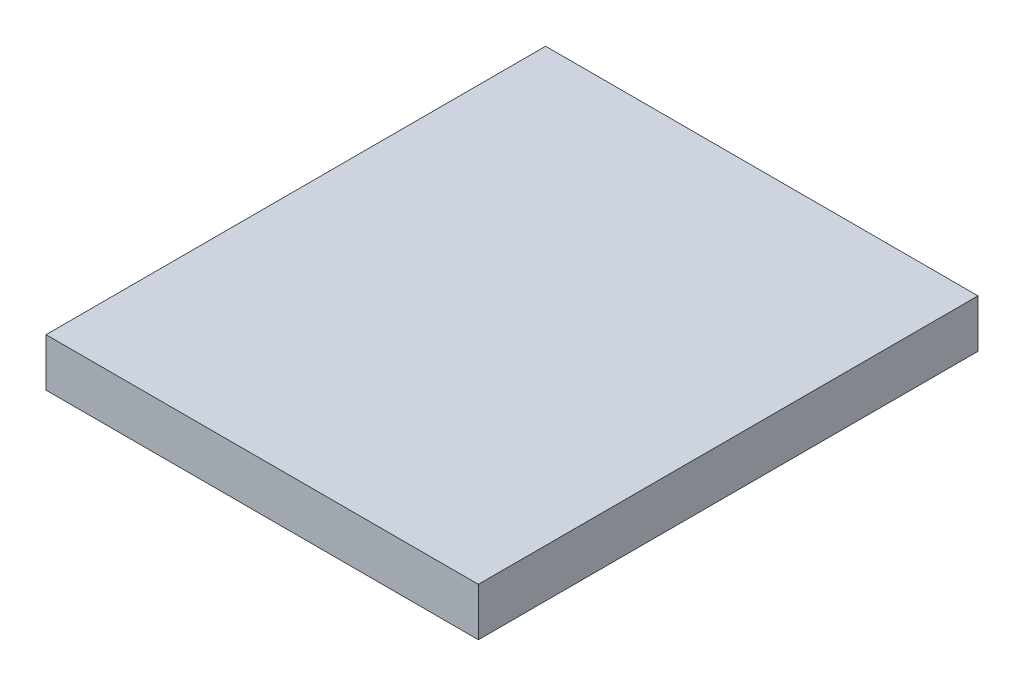
ISO-10303-21;
HEADER;
FILE_DESCRIPTION(('STEP AP214'),'2;1');
FILE_NAME('part.step','',(''),(''),'','','');
FILE_SCHEMA(('AUTOMOTIVE_DESIGN { 1 0 10303 214 1 1 1 1 }'));
ENDSEC;
DATA;
#1=APPLICATION_CONTEXT('core data for automotive mechanical design processes');
#2=APPLICATION_PROTOCOL_DEFINITION('international standard','automotive_design',2000,#1);
#3=PRODUCT_CONTEXT('',#1,'mechanical');
#4=PRODUCT('Part','Part','',(#3));
#5=PRODUCT_RELATED_PRODUCT_CATEGORY('part','',(#4));
#6=PRODUCT_DEFINITION_FORMATION('','',#4);
#7=PRODUCT_DEFINITION_CONTEXT('part definition',#1,'design');
#8=PRODUCT_DEFINITION('design','',#6,#7);
#9=PRODUCT_DEFINITION_SHAPE('','',#8);
#10=(LENGTH_UNIT() NAMED_UNIT(*) SI_UNIT(.MILLI.,.METRE.));
#11=(NAMED_UNIT(*) PLANE_ANGLE_UNIT() SI_UNIT($,.RADIAN.));
#12=(NAMED_UNIT(*) SI_UNIT($,.STERADIAN.) SOLID_ANGLE_UNIT());
#13=UNCERTAINTY_MEASURE_WITH_UNIT(LENGTH_MEASURE(1.E-05),#10,'distance_accuracy_value','');
#14=(GEOMETRIC_REPRESENTATION_CONTEXT(3) GLOBAL_UNCERTAINTY_ASSIGNED_CONTEXT((#13)) GLOBAL_UNIT_ASSIGNED_CONTEXT((#10,
#11,#12)) REPRESENTATION_CONTEXT('',''));
#15=CARTESIAN_POINT('',(0.,0.,0.));
#16=DIRECTION('',(0.,0.,1.));
#17=DIRECTION('',(1.,0.,0.));
#18=AXIS2_PLACEMENT_3D('',#15,#16,#17);
#19=CARTESIAN_POINT('',(15.5142135623731,0.7,-2.6));
#20=DIRECTION('',(0.,0.,-1.));
#21=DIRECTION('',(0.707106781186548,0.707106781186548,0.));
#22=AXIS2_PLACEMENT_3D('',#19,#20,#21);
#23=PLANE('',#22);
#24=DIRECTION('',(-1.,0.,0.));
#25=VECTOR('',#24,1.);
#26=CARTESIAN_POINT('',(15.5142135623731,1.2,-2.6));
#27=LINE('',#26,#25);
#28=CARTESIAN_POINT('',(15.5142135623731,1.2,-2.6));
#29=VERTEX_POINT('',#28);
#30=CARTESIAN_POINT('',(11.0142135623731,1.2,-2.6));
#31=VERTEX_POINT('',#30);
#32=EDGE_CURVE('E36',#29,#31,#27,.T.);
#33=ORIENTED_EDGE('',*,*,#32,.F.);
#34=DIRECTION('',(0.,1.,0.));
#35=VECTOR('',#34,1.);
#36=CARTESIAN_POINT('',(15.5142135623731,0.7,-2.6));
#37=LINE('',#36,#35);
#38=CARTESIAN_POINT('',(15.5142135623731,0.7,-2.6));
#39=VERTEX_POINT('',#38);
#40=EDGE_CURVE('E75',#39,#29,#37,.T.);
#41=ORIENTED_EDGE('',*,*,#40,.F.);
#42=DIRECTION('',(-1.,0.,0.));
#43=VECTOR('',#42,1.);
#44=CARTESIAN_POINT('',(15.5142135623731,0.7,-2.6));
#45=LINE('',#44,#43);
#46=CARTESIAN_POINT('',(11.0142135623731,0.7,-2.6));
#47=VERTEX_POINT('',#46);
#48=EDGE_CURVE('E11',#39,#47,#45,.T.);
#49=ORIENTED_EDGE('',*,*,#48,.T.);
#50=DIRECTION('',(0.,1.,0.));
#51=VECTOR('',#50,1.);
#52=CARTESIAN_POINT('',(11.0142135623731,0.7,-2.6));
#53=LINE('',#52,#51);
#54=EDGE_CURVE('E27',#47,#31,#53,.T.);
#55=ORIENTED_EDGE('',*,*,#54,.T.);
#56=EDGE_LOOP('',(#33,#41,#49,#55));
#57=FACE_BOUND('',#56,.T.);
#58=ADVANCED_FACE('F17',(#57),#23,.T.);
#59=CARTESIAN_POINT('',(15.5142135623731,0.7,2.6));
#60=DIRECTION('',(1.,0.,0.));
#61=DIRECTION('',(0.,0.707106781186548,0.707106781186548));
#62=AXIS2_PLACEMENT_3D('',#59,#60,#61);
#63=PLANE('',#62);
#64=DIRECTION('',(0.,0.,-1.));
#65=VECTOR('',#64,1.);
#66=CARTESIAN_POINT('',(15.5142135623731,1.2,2.6));
#67=LINE('',#66,#65);
#68=CARTESIAN_POINT('',(15.5142135623731,1.2,2.6));
#69=VERTEX_POINT('',#68);
#70=EDGE_CURVE('E82',#69,#29,#67,.T.);
#71=ORIENTED_EDGE('',*,*,#70,.F.);
#72=DIRECTION('',(0.,1.,0.));
#73=VECTOR('',#72,1.);
#74=CARTESIAN_POINT('',(15.5142135623731,0.7,2.6));
#75=LINE('',#74,#73);
#76=CARTESIAN_POINT('',(15.5142135623731,0.7,2.6));
#77=VERTEX_POINT('',#76);
#78=EDGE_CURVE('E76',#77,#69,#75,.T.);
#79=ORIENTED_EDGE('',*,*,#78,.F.);
#80=DIRECTION('',(0.,0.,-1.));
#81=VECTOR('',#80,1.);
#82=CARTESIAN_POINT('',(15.5142135623731,0.7,2.6));
#83=LINE('',#82,#81);
#84=EDGE_CURVE('E74',#77,#39,#83,.T.);
#85=ORIENTED_EDGE('',*,*,#84,.T.);
#86=ORIENTED_EDGE('',*,*,#40,.T.);
#87=EDGE_LOOP('',(#71,#79,#85,#86));
#88=FACE_BOUND('',#87,.T.);
#89=ADVANCED_FACE('F91',(#88),#63,.T.);
#90=CARTESIAN_POINT('',(11.0142135623731,0.7,2.6));
#91=DIRECTION('',(0.,0.,1.));
#92=DIRECTION('',(0.707106781186548,0.707106781186548,0.));
#93=AXIS2_PLACEMENT_3D('',#90,#91,#92);
#94=PLANE('',#93);
#95=DIRECTION('',(1.,0.,0.));
#96=VECTOR('',#95,1.);
#97=CARTESIAN_POINT('',(11.0142135623731,1.2,2.6));
#98=LINE('',#97,#96);
#99=CARTESIAN_POINT('',(11.0142135623731,1.2,2.6));
#100=VERTEX_POINT('',#99);
#101=EDGE_CURVE('E56',#100,#69,#98,.T.);
#102=ORIENTED_EDGE('',*,*,#101,.F.);
#103=DIRECTION('',(0.,1.,0.));
#104=VECTOR('',#103,1.);
#105=CARTESIAN_POINT('',(11.0142135623731,0.7,2.6));
#106=LINE('',#105,#104);
#107=CARTESIAN_POINT('',(11.0142135623731,0.7,2.6));
#108=VERTEX_POINT('',#107);
#109=EDGE_CURVE('E59',#108,#100,#106,.T.);
#110=ORIENTED_EDGE('',*,*,#109,.F.);
#111=DIRECTION('',(1.,0.,0.));
#112=VECTOR('',#111,1.);
#113=CARTESIAN_POINT('',(11.0142135623731,0.7,2.6));
#114=LINE('',#113,#112);
#115=EDGE_CURVE('E62',#108,#77,#114,.T.);
#116=ORIENTED_EDGE('',*,*,#115,.T.);
#117=ORIENTED_EDGE('',*,*,#78,.T.);
#118=EDGE_LOOP('',(#102,#110,#116,#117));
#119=FACE_BOUND('',#118,.T.);
#120=ADVANCED_FACE('F61',(#119),#94,.T.);
#121=CARTESIAN_POINT('',(11.0142135623731,0.7,-2.6));
#122=DIRECTION('',(-1.,0.,0.));
#123=DIRECTION('',(0.,0.707106781186548,0.707106781186548));
#124=AXIS2_PLACEMENT_3D('',#121,#122,#123);
#125=PLANE('',#124);
#126=DIRECTION('',(0.,0.,1.));
#127=VECTOR('',#126,1.);
#128=CARTESIAN_POINT('',(11.0142135623731,1.2,-2.6));
#129=LINE('',#128,#127);
#130=EDGE_CURVE('E85',#31,#100,#129,.T.);
#131=ORIENTED_EDGE('',*,*,#130,.F.);
#132=ORIENTED_EDGE('',*,*,#54,.F.);
#133=DIRECTION('',(0.,0.,1.));
#134=VECTOR('',#133,1.);
#135=CARTESIAN_POINT('',(11.0142135623731,0.7,-2.6));
#136=LINE('',#135,#134);
#137=EDGE_CURVE('E21',#47,#108,#136,.T.);
#138=ORIENTED_EDGE('',*,*,#137,.T.);
#139=ORIENTED_EDGE('',*,*,#109,.T.);
#140=EDGE_LOOP('',(#131,#132,#138,#139));
#141=FACE_BOUND('',#140,.T.);
#142=ADVANCED_FACE('F78',(#141),#125,.T.);
#143=CARTESIAN_POINT('',(0.,0.7,0.));
#144=DIRECTION('',(0.,1.,0.));
#145=DIRECTION('',(0.707106781186548,0.,0.707106781186548));
#146=AXIS2_PLACEMENT_3D('',#143,#144,#145);
#147=PLANE('',#146);
#148=ORIENTED_EDGE('',*,*,#48,.F.);
#149=ORIENTED_EDGE('',*,*,#84,.F.);
#150=ORIENTED_EDGE('',*,*,#115,.F.);
#151=ORIENTED_EDGE('',*,*,#137,.F.);
#152=EDGE_LOOP('',(#148,#149,#150,#151));
#153=FACE_BOUND('',#152,.T.);
#154=ADVANCED_FACE('F72',(#153),#147,.F.);
#155=CARTESIAN_POINT('',(0.,1.2,0.));
#156=DIRECTION('',(0.,1.,0.));
#157=DIRECTION('',(0.707106781186548,0.,0.707106781186548));
#158=AXIS2_PLACEMENT_3D('',#155,#156,#157);
#159=PLANE('',#158);
#160=ORIENTED_EDGE('',*,*,#32,.T.);
#161=ORIENTED_EDGE('',*,*,#130,.T.);
#162=ORIENTED_EDGE('',*,*,#101,.T.);
#163=ORIENTED_EDGE('',*,*,#70,.T.);
#164=EDGE_LOOP('',(#160,#161,#162,#163));
#165=FACE_BOUND('',#164,.T.);
#166=ADVANCED_FACE('F19',(#165),#159,.T.);
#167=CLOSED_SHELL('',(#58,#89,#120,#142,#154,#166));
#168=MANIFOLD_SOLID_BREP('B1',#167);
#169=ADVANCED_BREP_SHAPE_REPRESENTATION('',(#18,#168),#14);
#170=SHAPE_DEFINITION_REPRESENTATION(#9,#169);
ENDSEC;
END-ISO-10303-21;
